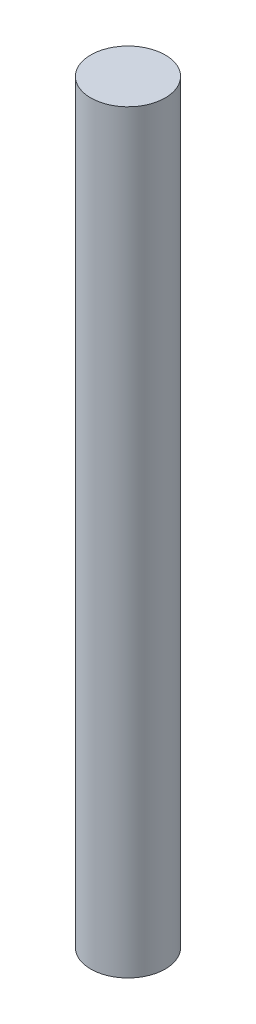
ISO-10303-21;
HEADER;
FILE_DESCRIPTION(('STEP AP214'),'2;1');
FILE_NAME('part.step','',(''),(''),'','','');
FILE_SCHEMA(('AUTOMOTIVE_DESIGN { 1 0 10303 214 1 1 1 1 }'));
ENDSEC;
DATA;
#1=APPLICATION_CONTEXT('core data for automotive mechanical design processes');
#2=APPLICATION_PROTOCOL_DEFINITION('international standard','automotive_design',2000,#1);
#3=PRODUCT_CONTEXT('',#1,'mechanical');
#4=PRODUCT('Part','Part','',(#3));
#5=PRODUCT_RELATED_PRODUCT_CATEGORY('part','',(#4));
#6=PRODUCT_DEFINITION_FORMATION('','',#4);
#7=PRODUCT_DEFINITION_CONTEXT('part definition',#1,'design');
#8=PRODUCT_DEFINITION('design','',#6,#7);
#9=PRODUCT_DEFINITION_SHAPE('','',#8);
#10=(LENGTH_UNIT() NAMED_UNIT(*) SI_UNIT(.MILLI.,.METRE.));
#11=(NAMED_UNIT(*) PLANE_ANGLE_UNIT() SI_UNIT($,.RADIAN.));
#12=(NAMED_UNIT(*) SI_UNIT($,.STERADIAN.) SOLID_ANGLE_UNIT());
#13=UNCERTAINTY_MEASURE_WITH_UNIT(LENGTH_MEASURE(1.E-05),#10,'distance_accuracy_value','');
#14=(GEOMETRIC_REPRESENTATION_CONTEXT(3) GLOBAL_UNCERTAINTY_ASSIGNED_CONTEXT((#13)) GLOBAL_UNIT_ASSIGNED_CONTEXT((#10,
#11,#12)) REPRESENTATION_CONTEXT('',''));
#15=CARTESIAN_POINT('',(0.,0.,0.));
#16=DIRECTION('',(0.,0.,1.));
#17=DIRECTION('',(1.,0.,0.));
#18=AXIS2_PLACEMENT_3D('',#15,#16,#17);
#19=CARTESIAN_POINT('',(0.,-2.,0.));
#20=DIRECTION('',(0.,1.,0.));
#21=DIRECTION('',(0.,0.,1.));
#22=AXIS2_PLACEMENT_3D('',#19,#20,#21);
#23=CYLINDRICAL_SURFACE('',#22,11.5);
#24=CARTESIAN_POINT('',(0.,-2.,0.));
#25=DIRECTION('',(0.,1.,0.));
#26=DIRECTION('',(0.,0.,1.));
#27=AXIS2_PLACEMENT_3D('',#24,#25,#26);
#28=CIRCLE('',#27,11.5);
#29=CARTESIAN_POINT('',(0.,-2.,11.5));
#30=VERTEX_POINT('',#29);
#31=EDGE_CURVE('E10',#30,#30,#28,.T.);
#32=ORIENTED_EDGE('',*,*,#31,.T.);
#33=EDGE_LOOP('',(#32));
#34=FACE_BOUND('',#33,.T.);
#35=CARTESIAN_POINT('',(0.,231.,0.));
#36=DIRECTION('',(0.,1.,0.));
#37=DIRECTION('',(0.,0.,1.));
#38=AXIS2_PLACEMENT_3D('',#35,#36,#37);
#39=CIRCLE('',#38,11.5);
#40=CARTESIAN_POINT('',(0.,231.,11.5));
#41=VERTEX_POINT('',#40);
#42=EDGE_CURVE('E39',#41,#41,#39,.T.);
#43=ORIENTED_EDGE('',*,*,#42,.F.);
#44=EDGE_LOOP('',(#43));
#45=FACE_BOUND('',#44,.T.);
#46=ADVANCED_FACE('F33',(#34,#45),#23,.T.);
#47=CARTESIAN_POINT('',(0.,-2.,0.));
#48=DIRECTION('',(0.,1.,0.));
#49=DIRECTION('',(0.,0.,1.));
#50=AXIS2_PLACEMENT_3D('',#47,#48,#49);
#51=PLANE('',#50);
#52=ORIENTED_EDGE('',*,*,#31,.F.);
#53=EDGE_LOOP('',(#52));
#54=FACE_BOUND('',#53,.T.);
#55=ADVANCED_FACE('F48',(#54),#51,.F.);
#56=CARTESIAN_POINT('',(0.,231.,0.));
#57=DIRECTION('',(0.,1.,0.));
#58=DIRECTION('',(0.,0.,1.));
#59=AXIS2_PLACEMENT_3D('',#56,#57,#58);
#60=PLANE('',#59);
#61=ORIENTED_EDGE('',*,*,#42,.T.);
#62=EDGE_LOOP('',(#61));
#63=FACE_BOUND('',#62,.T.);
#64=ADVANCED_FACE('F45',(#63),#60,.T.);
#65=CLOSED_SHELL('',(#46,#55,#64));
#66=MANIFOLD_SOLID_BREP('B2',#65);
#67=ADVANCED_BREP_SHAPE_REPRESENTATION('',(#18,#66),#14);
#68=SHAPE_DEFINITION_REPRESENTATION(#9,#67);
ENDSEC;
END-ISO-10303-21;
